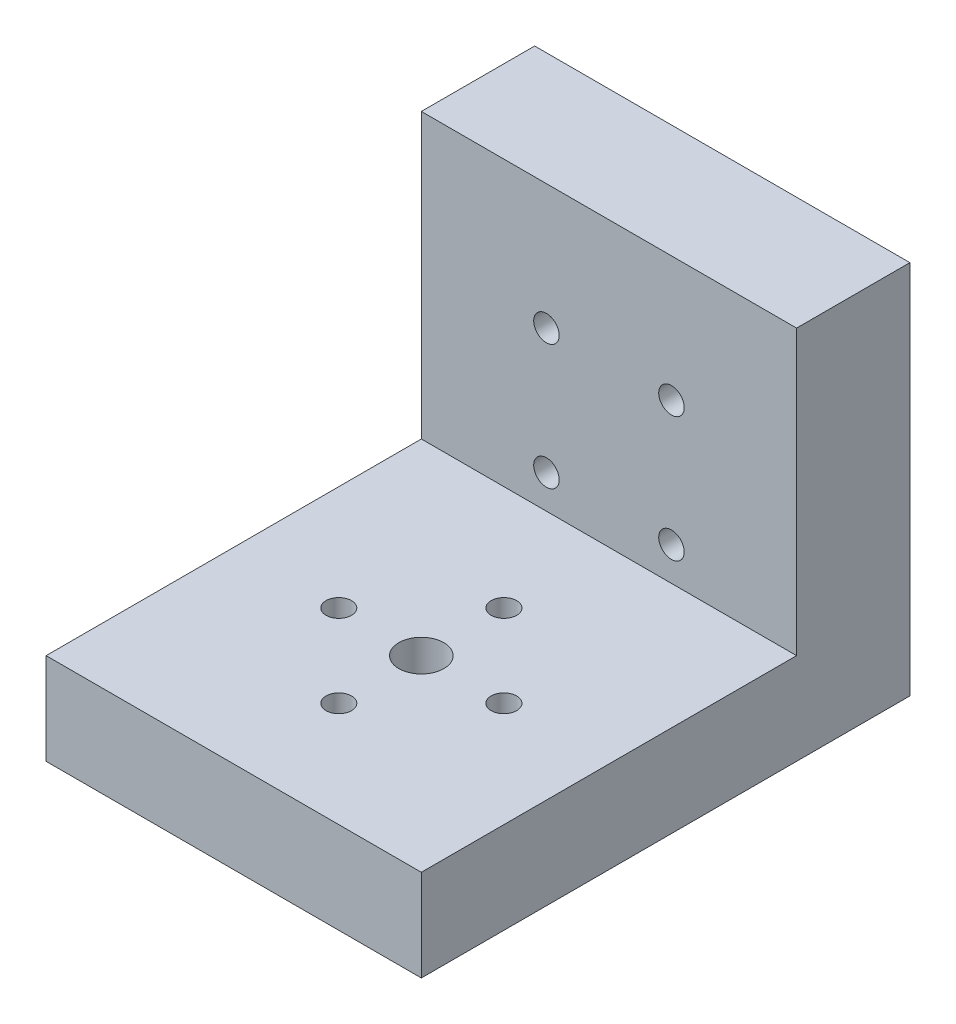
ISO-10303-21;
HEADER;
FILE_DESCRIPTION(('STEP AP214'),'2;1');
FILE_NAME('part.step','',(''),(''),'','','');
FILE_SCHEMA(('AUTOMOTIVE_DESIGN { 1 0 10303 214 1 1 1 1 }'));
ENDSEC;
DATA;
#1=APPLICATION_CONTEXT('core data for automotive mechanical design processes');
#2=APPLICATION_PROTOCOL_DEFINITION('international standard','automotive_design',2000,#1);
#3=PRODUCT_CONTEXT('',#1,'mechanical');
#4=PRODUCT('Part','Part','',(#3));
#5=PRODUCT_RELATED_PRODUCT_CATEGORY('part','',(#4));
#6=PRODUCT_DEFINITION_FORMATION('','',#4);
#7=PRODUCT_DEFINITION_CONTEXT('part definition',#1,'design');
#8=PRODUCT_DEFINITION('design','',#6,#7);
#9=PRODUCT_DEFINITION_SHAPE('','',#8);
#10=(LENGTH_UNIT() NAMED_UNIT(*) SI_UNIT(.MILLI.,.METRE.));
#11=(NAMED_UNIT(*) PLANE_ANGLE_UNIT() SI_UNIT($,.RADIAN.));
#12=(NAMED_UNIT(*) SI_UNIT($,.STERADIAN.) SOLID_ANGLE_UNIT());
#13=UNCERTAINTY_MEASURE_WITH_UNIT(LENGTH_MEASURE(1.E-05),#10,'distance_accuracy_value','');
#14=(GEOMETRIC_REPRESENTATION_CONTEXT(3) GLOBAL_UNCERTAINTY_ASSIGNED_CONTEXT((#13)) GLOBAL_UNIT_ASSIGNED_CONTEXT((#10,
#11,#12)) REPRESENTATION_CONTEXT('',''));
#15=CARTESIAN_POINT('',(0.,0.,0.));
#16=DIRECTION('',(0.,0.,1.));
#17=DIRECTION('',(1.,0.,0.));
#18=AXIS2_PLACEMENT_3D('',#15,#16,#17);
#19=CARTESIAN_POINT('',(0.,0.,15.1));
#20=DIRECTION('',(0.,1.,0.));
#21=DIRECTION('',(-1.,0.,0.));
#22=AXIS2_PLACEMENT_3D('',#19,#20,#21);
#23=PLANE('',#22);
#24=CARTESIAN_POINT('',(36.,0.,40.1));
#25=DIRECTION('',(0.,1.,0.));
#26=DIRECTION('',(0.,0.,1.));
#27=AXIS2_PLACEMENT_3D('',#24,#25,#26);
#28=CIRCLE('',#27,1.7);
#29=CARTESIAN_POINT('',(36.,0.,41.8));
#30=VERTEX_POINT('',#29);
#31=EDGE_CURVE('E162',#30,#30,#28,.T.);
#32=ORIENTED_EDGE('',*,*,#31,.T.);
#33=EDGE_LOOP('',(#32));
#34=FACE_BOUND('',#33,.T.);
#35=CARTESIAN_POINT('',(25.,0.,29.1));
#36=DIRECTION('',(0.,1.,0.));
#37=DIRECTION('',(0.,0.,1.));
#38=AXIS2_PLACEMENT_3D('',#35,#36,#37);
#39=CIRCLE('',#38,1.7);
#40=CARTESIAN_POINT('',(25.,0.,30.8));
#41=VERTEX_POINT('',#40);
#42=EDGE_CURVE('E237',#41,#41,#39,.T.);
#43=ORIENTED_EDGE('',*,*,#42,.T.);
#44=EDGE_LOOP('',(#43));
#45=FACE_BOUND('',#44,.T.);
#46=CARTESIAN_POINT('',(14.,0.,40.1));
#47=DIRECTION('',(0.,1.,0.));
#48=DIRECTION('',(0.,0.,1.));
#49=AXIS2_PLACEMENT_3D('',#46,#47,#48);
#50=CIRCLE('',#49,1.7);
#51=CARTESIAN_POINT('',(14.,0.,41.8));
#52=VERTEX_POINT('',#51);
#53=EDGE_CURVE('E241',#52,#52,#50,.T.);
#54=ORIENTED_EDGE('',*,*,#53,.T.);
#55=EDGE_LOOP('',(#54));
#56=FACE_BOUND('',#55,.T.);
#57=CARTESIAN_POINT('',(25.,0.,51.1));
#58=DIRECTION('',(0.,1.,0.));
#59=DIRECTION('',(0.,0.,1.));
#60=AXIS2_PLACEMENT_3D('',#57,#58,#59);
#61=CIRCLE('',#60,1.7);
#62=CARTESIAN_POINT('',(25.,0.,52.8));
#63=VERTEX_POINT('',#62);
#64=EDGE_CURVE('E245',#63,#63,#61,.T.);
#65=ORIENTED_EDGE('',*,*,#64,.T.);
#66=EDGE_LOOP('',(#65));
#67=FACE_BOUND('',#66,.T.);
#68=CARTESIAN_POINT('',(25.,0.,40.1));
#69=DIRECTION('',(0.,1.,0.));
#70=DIRECTION('',(0.,0.,1.));
#71=AXIS2_PLACEMENT_3D('',#68,#69,#70);
#72=CIRCLE('',#71,3.);
#73=CARTESIAN_POINT('',(25.,0.,43.1));
#74=VERTEX_POINT('',#73);
#75=EDGE_CURVE('E248',#74,#74,#72,.T.);
#76=ORIENTED_EDGE('',*,*,#75,.T.);
#77=EDGE_LOOP('',(#76));
#78=FACE_BOUND('',#77,.T.);
#79=DIRECTION('',(1.,0.,0.));
#80=VECTOR('',#79,1.);
#81=CARTESIAN_POINT('',(0.,0.,0.));
#82=LINE('',#81,#80);
#83=CARTESIAN_POINT('',(0.,0.,0.));
#84=VERTEX_POINT('',#83);
#85=CARTESIAN_POINT('',(50.,0.,0.));
#86=VERTEX_POINT('',#85);
#87=EDGE_CURVE('E105',#84,#86,#82,.T.);
#88=ORIENTED_EDGE('',*,*,#87,.T.);
#89=DIRECTION('',(0.,0.,-1.));
#90=VECTOR('',#89,1.);
#91=CARTESIAN_POINT('',(50.,0.,15.1));
#92=LINE('',#91,#90);
#93=CARTESIAN_POINT('',(50.,0.,65.1));
#94=VERTEX_POINT('',#93);
#95=EDGE_CURVE('E11',#94,#86,#92,.T.);
#96=ORIENTED_EDGE('',*,*,#95,.F.);
#97=DIRECTION('',(1.,0.,0.));
#98=VECTOR('',#97,1.);
#99=CARTESIAN_POINT('',(0.,0.,65.1));
#100=LINE('',#99,#98);
#101=CARTESIAN_POINT('',(0.,0.,65.1));
#102=VERTEX_POINT('',#101);
#103=EDGE_CURVE('E107',#102,#94,#100,.T.);
#104=ORIENTED_EDGE('',*,*,#103,.F.);
#105=DIRECTION('',(0.,0.,-1.));
#106=VECTOR('',#105,1.);
#107=CARTESIAN_POINT('',(0.,0.,15.1));
#108=LINE('',#107,#106);
#109=EDGE_CURVE('E91',#102,#84,#108,.T.);
#110=ORIENTED_EDGE('',*,*,#109,.T.);
#111=EDGE_LOOP('',(#88,#96,#104,#110));
#112=FACE_BOUND('',#111,.T.);
#113=ADVANCED_FACE('F45',(#34,#45,#56,#67,#78,#112),#23,.F.);
#114=CARTESIAN_POINT('',(50.,0.,15.1));
#115=DIRECTION('',(-1.,0.,0.));
#116=DIRECTION('',(0.,0.,1.));
#117=AXIS2_PLACEMENT_3D('',#114,#115,#116);
#118=PLANE('',#117);
#119=DIRECTION('',(0.,1.,0.));
#120=VECTOR('',#119,1.);
#121=CARTESIAN_POINT('',(50.,0.,0.));
#122=LINE('',#121,#120);
#123=CARTESIAN_POINT('',(50.,50.,0.));
#124=VERTEX_POINT('',#123);
#125=EDGE_CURVE('E113',#86,#124,#122,.T.);
#126=ORIENTED_EDGE('',*,*,#125,.T.);
#127=DIRECTION('',(0.,0.,-1.));
#128=VECTOR('',#127,1.);
#129=CARTESIAN_POINT('',(50.,50.,15.1));
#130=LINE('',#129,#128);
#131=CARTESIAN_POINT('',(50.,50.,15.1));
#132=VERTEX_POINT('',#131);
#133=EDGE_CURVE('E53',#132,#124,#130,.T.);
#134=ORIENTED_EDGE('',*,*,#133,.F.);
#135=DIRECTION('',(0.,1.,0.));
#136=VECTOR('',#135,1.);
#137=CARTESIAN_POINT('',(50.,0.,15.1));
#138=LINE('',#137,#136);
#139=CARTESIAN_POINT('',(50.,12.2,15.1));
#140=VERTEX_POINT('',#139);
#141=EDGE_CURVE('E99',#140,#132,#138,.T.);
#142=ORIENTED_EDGE('',*,*,#141,.F.);
#143=DIRECTION('',(0.,0.,-1.));
#144=VECTOR('',#143,1.);
#145=CARTESIAN_POINT('',(50.,12.2,65.1));
#146=LINE('',#145,#144);
#147=CARTESIAN_POINT('',(50.,12.2,65.1));
#148=VERTEX_POINT('',#147);
#149=EDGE_CURVE('E166',#148,#140,#146,.T.);
#150=ORIENTED_EDGE('',*,*,#149,.F.);
#151=DIRECTION('',(0.,1.,0.));
#152=VECTOR('',#151,1.);
#153=CARTESIAN_POINT('',(50.,0.,65.1));
#154=LINE('',#153,#152);
#155=EDGE_CURVE('E141',#94,#148,#154,.T.);
#156=ORIENTED_EDGE('',*,*,#155,.F.);
#157=ORIENTED_EDGE('',*,*,#95,.T.);
#158=EDGE_LOOP('',(#126,#134,#142,#150,#156,#157));
#159=FACE_BOUND('',#158,.T.);
#160=ADVANCED_FACE('F135',(#159),#118,.F.);
#161=CARTESIAN_POINT('',(0.,50.,15.1));
#162=DIRECTION('',(0.,-1.,0.));
#163=DIRECTION('',(1.,0.,0.));
#164=AXIS2_PLACEMENT_3D('',#161,#162,#163);
#165=PLANE('',#164);
#166=DIRECTION('',(-1.,0.,0.));
#167=VECTOR('',#166,1.);
#168=CARTESIAN_POINT('',(0.,50.,0.));
#169=LINE('',#168,#167);
#170=CARTESIAN_POINT('',(0.,50.,0.));
#171=VERTEX_POINT('',#170);
#172=EDGE_CURVE('E100',#124,#171,#169,.T.);
#173=ORIENTED_EDGE('',*,*,#172,.T.);
#174=DIRECTION('',(0.,0.,-1.));
#175=VECTOR('',#174,1.);
#176=CARTESIAN_POINT('',(0.,50.,15.1));
#177=LINE('',#176,#175);
#178=CARTESIAN_POINT('',(0.,50.,15.1));
#179=VERTEX_POINT('',#178);
#180=EDGE_CURVE('E94',#179,#171,#177,.T.);
#181=ORIENTED_EDGE('',*,*,#180,.F.);
#182=DIRECTION('',(-1.,0.,0.));
#183=VECTOR('',#182,1.);
#184=CARTESIAN_POINT('',(0.,50.,15.1));
#185=LINE('',#184,#183);
#186=EDGE_CURVE('E66',#132,#179,#185,.T.);
#187=ORIENTED_EDGE('',*,*,#186,.F.);
#188=ORIENTED_EDGE('',*,*,#133,.T.);
#189=EDGE_LOOP('',(#173,#181,#187,#188));
#190=FACE_BOUND('',#189,.T.);
#191=ADVANCED_FACE('F133',(#190),#165,.F.);
#192=CARTESIAN_POINT('',(0.,0.,15.1));
#193=DIRECTION('',(1.,0.,0.));
#194=DIRECTION('',(0.,0.,-1.));
#195=AXIS2_PLACEMENT_3D('',#192,#193,#194);
#196=PLANE('',#195);
#197=DIRECTION('',(0.,-1.,0.));
#198=VECTOR('',#197,1.);
#199=CARTESIAN_POINT('',(0.,0.,0.));
#200=LINE('',#199,#198);
#201=EDGE_CURVE('E86',#171,#84,#200,.T.);
#202=ORIENTED_EDGE('',*,*,#201,.T.);
#203=ORIENTED_EDGE('',*,*,#109,.F.);
#204=DIRECTION('',(0.,-1.,0.));
#205=VECTOR('',#204,1.);
#206=CARTESIAN_POINT('',(0.,0.,65.1));
#207=LINE('',#206,#205);
#208=CARTESIAN_POINT('',(0.,12.2,65.1));
#209=VERTEX_POINT('',#208);
#210=EDGE_CURVE('E147',#209,#102,#207,.T.);
#211=ORIENTED_EDGE('',*,*,#210,.F.);
#212=DIRECTION('',(0.,0.,-1.));
#213=VECTOR('',#212,1.);
#214=CARTESIAN_POINT('',(0.,12.2,65.1));
#215=LINE('',#214,#213);
#216=CARTESIAN_POINT('',(0.,12.2,15.1));
#217=VERTEX_POINT('',#216);
#218=EDGE_CURVE('E159',#209,#217,#215,.T.);
#219=ORIENTED_EDGE('',*,*,#218,.T.);
#220=DIRECTION('',(0.,-1.,0.));
#221=VECTOR('',#220,1.);
#222=CARTESIAN_POINT('',(0.,0.,15.1));
#223=LINE('',#222,#221);
#224=EDGE_CURVE('E110',#179,#217,#223,.T.);
#225=ORIENTED_EDGE('',*,*,#224,.F.);
#226=ORIENTED_EDGE('',*,*,#180,.T.);
#227=EDGE_LOOP('',(#202,#203,#211,#219,#225,#226));
#228=FACE_BOUND('',#227,.T.);
#229=ADVANCED_FACE('F88',(#228),#196,.F.);
#230=CARTESIAN_POINT('',(0.,0.,15.1));
#231=DIRECTION('',(0.,0.,1.));
#232=DIRECTION('',(1.,0.,0.));
#233=AXIS2_PLACEMENT_3D('',#230,#231,#232);
#234=PLANE('',#233);
#235=DIRECTION('',(-1.,0.,0.));
#236=VECTOR('',#235,1.);
#237=CARTESIAN_POINT('',(0.,12.2,15.1));
#238=LINE('',#237,#236);
#239=EDGE_CURVE('E60',#140,#217,#238,.T.);
#240=ORIENTED_EDGE('',*,*,#239,.F.);
#241=ORIENTED_EDGE('',*,*,#141,.T.);
#242=ORIENTED_EDGE('',*,*,#186,.T.);
#243=ORIENTED_EDGE('',*,*,#224,.T.);
#244=EDGE_LOOP('',(#240,#241,#242,#243));
#245=FACE_BOUND('',#244,.T.);
#246=CARTESIAN_POINT('',(33.33,33.33,15.1));
#247=DIRECTION('',(0.,0.,1.));
#248=DIRECTION('',(1.,0.,0.));
#249=AXIS2_PLACEMENT_3D('',#246,#247,#248);
#250=CIRCLE('',#249,1.7);
#251=CARTESIAN_POINT('',(35.03,33.33,15.1));
#252=VERTEX_POINT('',#251);
#253=EDGE_CURVE('E178',#252,#252,#250,.T.);
#254=ORIENTED_EDGE('',*,*,#253,.F.);
#255=EDGE_LOOP('',(#254));
#256=FACE_BOUND('',#255,.T.);
#257=CARTESIAN_POINT('',(16.67,16.67,15.1));
#258=DIRECTION('',(0.,0.,1.));
#259=DIRECTION('',(1.,0.,0.));
#260=AXIS2_PLACEMENT_3D('',#257,#258,#259);
#261=CIRCLE('',#260,1.7);
#262=CARTESIAN_POINT('',(18.37,16.67,15.1));
#263=VERTEX_POINT('',#262);
#264=EDGE_CURVE('E186',#263,#263,#261,.T.);
#265=ORIENTED_EDGE('',*,*,#264,.F.);
#266=EDGE_LOOP('',(#265));
#267=FACE_BOUND('',#266,.T.);
#268=CARTESIAN_POINT('',(33.33,16.67,15.1));
#269=DIRECTION('',(0.,0.,1.));
#270=DIRECTION('',(1.,0.,0.));
#271=AXIS2_PLACEMENT_3D('',#268,#269,#270);
#272=CIRCLE('',#271,1.7);
#273=CARTESIAN_POINT('',(35.03,16.67,15.1));
#274=VERTEX_POINT('',#273);
#275=EDGE_CURVE('E170',#274,#274,#272,.T.);
#276=ORIENTED_EDGE('',*,*,#275,.F.);
#277=EDGE_LOOP('',(#276));
#278=FACE_BOUND('',#277,.T.);
#279=CARTESIAN_POINT('',(16.67,33.33,15.1));
#280=DIRECTION('',(0.,0.,1.));
#281=DIRECTION('',(1.,0.,0.));
#282=AXIS2_PLACEMENT_3D('',#279,#280,#281);
#283=CIRCLE('',#282,1.7);
#284=CARTESIAN_POINT('',(18.37,33.33,15.1));
#285=VERTEX_POINT('',#284);
#286=EDGE_CURVE('E121',#285,#285,#283,.T.);
#287=ORIENTED_EDGE('',*,*,#286,.F.);
#288=EDGE_LOOP('',(#287));
#289=FACE_BOUND('',#288,.T.);
#290=ADVANCED_FACE('F200',(#245,#256,#267,#278,#289),#234,.T.);
#291=CARTESIAN_POINT('',(0.,0.,0.));
#292=DIRECTION('',(0.,0.,1.));
#293=DIRECTION('',(1.,0.,0.));
#294=AXIS2_PLACEMENT_3D('',#291,#292,#293);
#295=PLANE('',#294);
#296=CARTESIAN_POINT('',(33.33,33.33,0.));
#297=DIRECTION('',(0.,0.,1.));
#298=DIRECTION('',(1.,0.,0.));
#299=AXIS2_PLACEMENT_3D('',#296,#297,#298);
#300=CIRCLE('',#299,1.7);
#301=CARTESIAN_POINT('',(35.03,33.33,0.));
#302=VERTEX_POINT('',#301);
#303=EDGE_CURVE('E182',#302,#302,#300,.T.);
#304=ORIENTED_EDGE('',*,*,#303,.T.);
#305=EDGE_LOOP('',(#304));
#306=FACE_BOUND('',#305,.T.);
#307=CARTESIAN_POINT('',(16.67,16.67,0.));
#308=DIRECTION('',(0.,0.,1.));
#309=DIRECTION('',(1.,0.,0.));
#310=AXIS2_PLACEMENT_3D('',#307,#308,#309);
#311=CIRCLE('',#310,1.7);
#312=CARTESIAN_POINT('',(18.37,16.67,0.));
#313=VERTEX_POINT('',#312);
#314=EDGE_CURVE('E174',#313,#313,#311,.T.);
#315=ORIENTED_EDGE('',*,*,#314,.T.);
#316=EDGE_LOOP('',(#315));
#317=FACE_BOUND('',#316,.T.);
#318=CARTESIAN_POINT('',(33.33,16.67,0.));
#319=DIRECTION('',(0.,0.,1.));
#320=DIRECTION('',(1.,0.,0.));
#321=AXIS2_PLACEMENT_3D('',#318,#319,#320);
#322=CIRCLE('',#321,1.7);
#323=CARTESIAN_POINT('',(35.03,16.67,0.));
#324=VERTEX_POINT('',#323);
#325=EDGE_CURVE('E169',#324,#324,#322,.T.);
#326=ORIENTED_EDGE('',*,*,#325,.T.);
#327=EDGE_LOOP('',(#326));
#328=FACE_BOUND('',#327,.T.);
#329=CARTESIAN_POINT('',(16.67,33.33,0.));
#330=DIRECTION('',(0.,0.,1.));
#331=DIRECTION('',(1.,0.,0.));
#332=AXIS2_PLACEMENT_3D('',#329,#330,#331);
#333=CIRCLE('',#332,1.7);
#334=CARTESIAN_POINT('',(18.37,33.33,0.));
#335=VERTEX_POINT('',#334);
#336=EDGE_CURVE('E115',#335,#335,#333,.T.);
#337=ORIENTED_EDGE('',*,*,#336,.T.);
#338=EDGE_LOOP('',(#337));
#339=FACE_BOUND('',#338,.T.);
#340=ORIENTED_EDGE('',*,*,#87,.F.);
#341=ORIENTED_EDGE('',*,*,#201,.F.);
#342=ORIENTED_EDGE('',*,*,#172,.F.);
#343=ORIENTED_EDGE('',*,*,#125,.F.);
#344=EDGE_LOOP('',(#340,#341,#342,#343));
#345=FACE_BOUND('',#344,.T.);
#346=ADVANCED_FACE('F112',(#306,#317,#328,#339,#345),#295,.F.);
#347=CARTESIAN_POINT('',(16.67,33.33,0.));
#348=DIRECTION('',(0.,0.,1.));
#349=DIRECTION('',(1.,0.,0.));
#350=AXIS2_PLACEMENT_3D('',#347,#348,#349);
#351=CYLINDRICAL_SURFACE('',#350,1.7);
#352=ORIENTED_EDGE('',*,*,#336,.F.);
#353=EDGE_LOOP('',(#352));
#354=FACE_BOUND('',#353,.T.);
#355=ORIENTED_EDGE('',*,*,#286,.T.);
#356=EDGE_LOOP('',(#355));
#357=FACE_BOUND('',#356,.T.);
#358=ADVANCED_FACE('F393',(#354,#357),#351,.F.);
#359=CARTESIAN_POINT('',(33.33,16.67,0.));
#360=DIRECTION('',(0.,0.,1.));
#361=DIRECTION('',(1.,0.,0.));
#362=AXIS2_PLACEMENT_3D('',#359,#360,#361);
#363=CYLINDRICAL_SURFACE('',#362,1.7);
#364=ORIENTED_EDGE('',*,*,#325,.F.);
#365=EDGE_LOOP('',(#364));
#366=FACE_BOUND('',#365,.T.);
#367=ORIENTED_EDGE('',*,*,#275,.T.);
#368=EDGE_LOOP('',(#367));
#369=FACE_BOUND('',#368,.T.);
#370=ADVANCED_FACE('F383',(#366,#369),#363,.F.);
#371=CARTESIAN_POINT('',(16.67,16.67,0.));
#372=DIRECTION('',(0.,0.,1.));
#373=DIRECTION('',(1.,0.,0.));
#374=AXIS2_PLACEMENT_3D('',#371,#372,#373);
#375=CYLINDRICAL_SURFACE('',#374,1.7);
#376=ORIENTED_EDGE('',*,*,#314,.F.);
#377=EDGE_LOOP('',(#376));
#378=FACE_BOUND('',#377,.T.);
#379=ORIENTED_EDGE('',*,*,#264,.T.);
#380=EDGE_LOOP('',(#379));
#381=FACE_BOUND('',#380,.T.);
#382=ADVANCED_FACE('F221',(#378,#381),#375,.F.);
#383=CARTESIAN_POINT('',(33.33,33.33,0.));
#384=DIRECTION('',(0.,0.,1.));
#385=DIRECTION('',(1.,0.,0.));
#386=AXIS2_PLACEMENT_3D('',#383,#384,#385);
#387=CYLINDRICAL_SURFACE('',#386,1.7);
#388=ORIENTED_EDGE('',*,*,#303,.F.);
#389=EDGE_LOOP('',(#388));
#390=FACE_BOUND('',#389,.T.);
#391=ORIENTED_EDGE('',*,*,#253,.T.);
#392=EDGE_LOOP('',(#391));
#393=FACE_BOUND('',#392,.T.);
#394=ADVANCED_FACE('F210',(#390,#393),#387,.F.);
#395=CARTESIAN_POINT('',(0.,12.2,65.1));
#396=DIRECTION('',(0.,-1.,0.));
#397=DIRECTION('',(0.,0.,-1.));
#398=AXIS2_PLACEMENT_3D('',#395,#396,#397);
#399=PLANE('',#398);
#400=CARTESIAN_POINT('',(36.,12.2,40.1));
#401=DIRECTION('',(0.,1.,0.));
#402=DIRECTION('',(0.,0.,1.));
#403=AXIS2_PLACEMENT_3D('',#400,#401,#402);
#404=CIRCLE('',#403,1.7);
#405=CARTESIAN_POINT('',(36.,12.2,41.8));
#406=VERTEX_POINT('',#405);
#407=EDGE_CURVE('E257',#406,#406,#404,.T.);
#408=ORIENTED_EDGE('',*,*,#407,.F.);
#409=EDGE_LOOP('',(#408));
#410=FACE_BOUND('',#409,.T.);
#411=CARTESIAN_POINT('',(25.,12.2,29.1));
#412=DIRECTION('',(0.,1.,0.));
#413=DIRECTION('',(0.,0.,1.));
#414=AXIS2_PLACEMENT_3D('',#411,#412,#413);
#415=CIRCLE('',#414,1.7);
#416=CARTESIAN_POINT('',(25.,12.2,30.8));
#417=VERTEX_POINT('',#416);
#418=EDGE_CURVE('E270',#417,#417,#415,.T.);
#419=ORIENTED_EDGE('',*,*,#418,.F.);
#420=EDGE_LOOP('',(#419));
#421=FACE_BOUND('',#420,.T.);
#422=CARTESIAN_POINT('',(14.,12.2,40.1));
#423=DIRECTION('',(0.,1.,0.));
#424=DIRECTION('',(0.,0.,1.));
#425=AXIS2_PLACEMENT_3D('',#422,#423,#424);
#426=CIRCLE('',#425,1.7);
#427=CARTESIAN_POINT('',(14.,12.2,41.8));
#428=VERTEX_POINT('',#427);
#429=EDGE_CURVE('E263',#428,#428,#426,.T.);
#430=ORIENTED_EDGE('',*,*,#429,.F.);
#431=EDGE_LOOP('',(#430));
#432=FACE_BOUND('',#431,.T.);
#433=CARTESIAN_POINT('',(25.,12.2,51.1));
#434=DIRECTION('',(0.,1.,0.));
#435=DIRECTION('',(0.,0.,1.));
#436=AXIS2_PLACEMENT_3D('',#433,#434,#435);
#437=CIRCLE('',#436,1.7);
#438=CARTESIAN_POINT('',(25.,12.2,52.8));
#439=VERTEX_POINT('',#438);
#440=EDGE_CURVE('E252',#439,#439,#437,.T.);
#441=ORIENTED_EDGE('',*,*,#440,.F.);
#442=EDGE_LOOP('',(#441));
#443=FACE_BOUND('',#442,.T.);
#444=CARTESIAN_POINT('',(25.,12.2,40.1));
#445=DIRECTION('',(0.,1.,0.));
#446=DIRECTION('',(0.,0.,1.));
#447=AXIS2_PLACEMENT_3D('',#444,#445,#446);
#448=CIRCLE('',#447,3.);
#449=CARTESIAN_POINT('',(25.,12.2,43.1));
#450=VERTEX_POINT('',#449);
#451=EDGE_CURVE('E251',#450,#450,#448,.T.);
#452=ORIENTED_EDGE('',*,*,#451,.F.);
#453=EDGE_LOOP('',(#452));
#454=FACE_BOUND('',#453,.T.);
#455=ORIENTED_EDGE('',*,*,#239,.T.);
#456=ORIENTED_EDGE('',*,*,#218,.F.);
#457=DIRECTION('',(-1.,0.,0.));
#458=VECTOR('',#457,1.);
#459=CARTESIAN_POINT('',(0.,12.2,65.1));
#460=LINE('',#459,#458);
#461=EDGE_CURVE('E152',#148,#209,#460,.T.);
#462=ORIENTED_EDGE('',*,*,#461,.F.);
#463=ORIENTED_EDGE('',*,*,#149,.T.);
#464=EDGE_LOOP('',(#455,#456,#462,#463));
#465=FACE_BOUND('',#464,.T.);
#466=ADVANCED_FACE('F204',(#410,#421,#432,#443,#454,#465),#399,.F.);
#467=CARTESIAN_POINT('',(0.,0.,65.1));
#468=DIRECTION('',(0.,0.,-1.));
#469=DIRECTION('',(-1.,0.,0.));
#470=AXIS2_PLACEMENT_3D('',#467,#468,#469);
#471=PLANE('',#470);
#472=ORIENTED_EDGE('',*,*,#210,.T.);
#473=ORIENTED_EDGE('',*,*,#103,.T.);
#474=ORIENTED_EDGE('',*,*,#155,.T.);
#475=ORIENTED_EDGE('',*,*,#461,.T.);
#476=EDGE_LOOP('',(#472,#473,#474,#475));
#477=FACE_BOUND('',#476,.T.);
#478=ADVANCED_FACE('F145',(#477),#471,.F.);
#479=CARTESIAN_POINT('',(25.,0.,40.1));
#480=DIRECTION('',(0.,1.,0.));
#481=DIRECTION('',(0.,0.,1.));
#482=AXIS2_PLACEMENT_3D('',#479,#480,#481);
#483=CYLINDRICAL_SURFACE('',#482,3.);
#484=ORIENTED_EDGE('',*,*,#75,.F.);
#485=EDGE_LOOP('',(#484));
#486=FACE_BOUND('',#485,.T.);
#487=ORIENTED_EDGE('',*,*,#451,.T.);
#488=EDGE_LOOP('',(#487));
#489=FACE_BOUND('',#488,.T.);
#490=ADVANCED_FACE('F218',(#486,#489),#483,.F.);
#491=CARTESIAN_POINT('',(25.,0.,51.1));
#492=DIRECTION('',(0.,1.,0.));
#493=DIRECTION('',(0.,0.,1.));
#494=AXIS2_PLACEMENT_3D('',#491,#492,#493);
#495=CYLINDRICAL_SURFACE('',#494,1.7);
#496=ORIENTED_EDGE('',*,*,#64,.F.);
#497=EDGE_LOOP('',(#496));
#498=FACE_BOUND('',#497,.T.);
#499=ORIENTED_EDGE('',*,*,#440,.T.);
#500=EDGE_LOOP('',(#499));
#501=FACE_BOUND('',#500,.T.);
#502=ADVANCED_FACE('F287',(#498,#501),#495,.F.);
#503=CARTESIAN_POINT('',(14.,0.,40.1));
#504=DIRECTION('',(0.,1.,0.));
#505=DIRECTION('',(0.,0.,1.));
#506=AXIS2_PLACEMENT_3D('',#503,#504,#505);
#507=CYLINDRICAL_SURFACE('',#506,1.7);
#508=ORIENTED_EDGE('',*,*,#53,.F.);
#509=EDGE_LOOP('',(#508));
#510=FACE_BOUND('',#509,.T.);
#511=ORIENTED_EDGE('',*,*,#429,.T.);
#512=EDGE_LOOP('',(#511));
#513=FACE_BOUND('',#512,.T.);
#514=ADVANCED_FACE('F292',(#510,#513),#507,.F.);
#515=CARTESIAN_POINT('',(25.,0.,29.1));
#516=DIRECTION('',(0.,1.,0.));
#517=DIRECTION('',(0.,0.,1.));
#518=AXIS2_PLACEMENT_3D('',#515,#516,#517);
#519=CYLINDRICAL_SURFACE('',#518,1.7);
#520=ORIENTED_EDGE('',*,*,#42,.F.);
#521=EDGE_LOOP('',(#520));
#522=FACE_BOUND('',#521,.T.);
#523=ORIENTED_EDGE('',*,*,#418,.T.);
#524=EDGE_LOOP('',(#523));
#525=FACE_BOUND('',#524,.T.);
#526=ADVANCED_FACE('F280',(#522,#525),#519,.F.);
#527=CARTESIAN_POINT('',(36.,0.,40.1));
#528=DIRECTION('',(0.,1.,0.));
#529=DIRECTION('',(0.,0.,1.));
#530=AXIS2_PLACEMENT_3D('',#527,#528,#529);
#531=CYLINDRICAL_SURFACE('',#530,1.7);
#532=ORIENTED_EDGE('',*,*,#31,.F.);
#533=EDGE_LOOP('',(#532));
#534=FACE_BOUND('',#533,.T.);
#535=ORIENTED_EDGE('',*,*,#407,.T.);
#536=EDGE_LOOP('',(#535));
#537=FACE_BOUND('',#536,.T.);
#538=ADVANCED_FACE('F298',(#534,#537),#531,.F.);
#539=CLOSED_SHELL('',(#113,#160,#191,#229,#290,#346,#358,#370,#382,#394,#466,#478,#490,#502,
#514,#526,#538));
#540=MANIFOLD_SOLID_BREP('B2',#539);
#541=ADVANCED_BREP_SHAPE_REPRESENTATION('',(#18,#540),#14);
#542=SHAPE_DEFINITION_REPRESENTATION(#9,#541);
ENDSEC;
END-ISO-10303-21;
